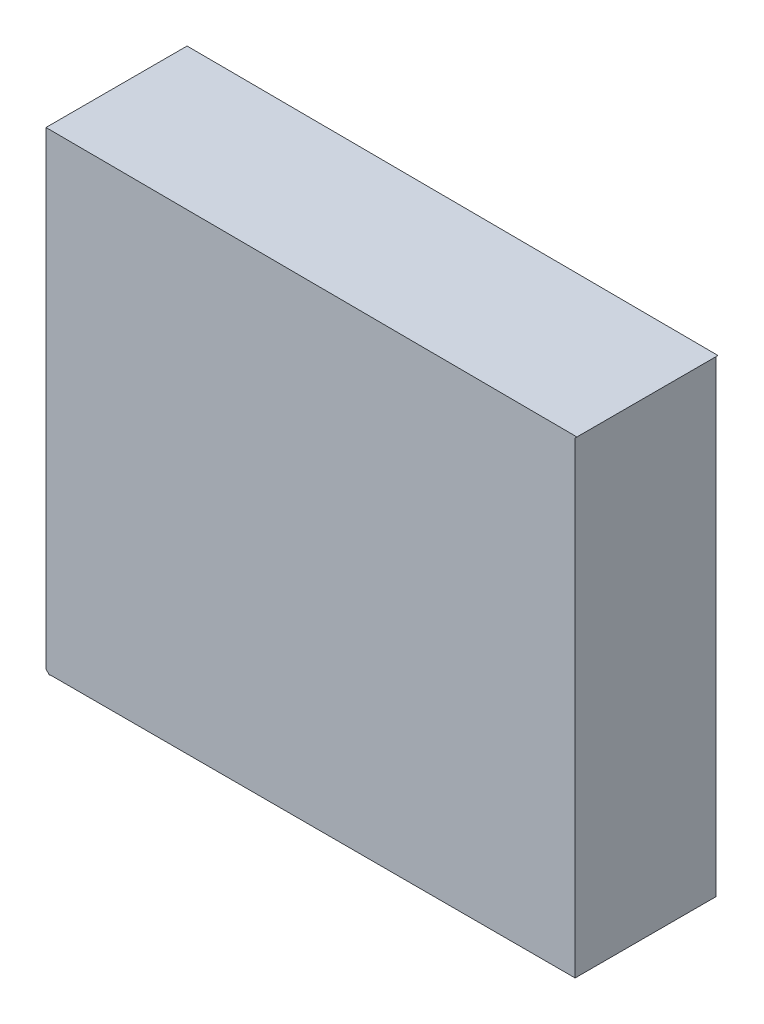
ISO-10303-21;
HEADER;
FILE_DESCRIPTION(('STEP AP214'),'2;1');
FILE_NAME('part.step','',(''),(''),'','','');
FILE_SCHEMA(('AUTOMOTIVE_DESIGN { 1 0 10303 214 1 1 1 1 }'));
ENDSEC;
DATA;
#1=APPLICATION_CONTEXT('core data for automotive mechanical design processes');
#2=APPLICATION_PROTOCOL_DEFINITION('international standard','automotive_design',2000,#1);
#3=PRODUCT_CONTEXT('',#1,'mechanical');
#4=PRODUCT('Part','Part','',(#3));
#5=PRODUCT_RELATED_PRODUCT_CATEGORY('part','',(#4));
#6=PRODUCT_DEFINITION_FORMATION('','',#4);
#7=PRODUCT_DEFINITION_CONTEXT('part definition',#1,'design');
#8=PRODUCT_DEFINITION('design','',#6,#7);
#9=PRODUCT_DEFINITION_SHAPE('','',#8);
#10=(LENGTH_UNIT() NAMED_UNIT(*) SI_UNIT(.MILLI.,.METRE.));
#11=(NAMED_UNIT(*) PLANE_ANGLE_UNIT() SI_UNIT($,.RADIAN.));
#12=(NAMED_UNIT(*) SI_UNIT($,.STERADIAN.) SOLID_ANGLE_UNIT());
#13=UNCERTAINTY_MEASURE_WITH_UNIT(LENGTH_MEASURE(1.E-05),#10,'distance_accuracy_value','');
#14=(GEOMETRIC_REPRESENTATION_CONTEXT(3) GLOBAL_UNCERTAINTY_ASSIGNED_CONTEXT((#13)) GLOBAL_UNIT_ASSIGNED_CONTEXT((#10,
#11,#12)) REPRESENTATION_CONTEXT('',''));
#15=CARTESIAN_POINT('',(0.,0.,0.));
#16=DIRECTION('',(0.,0.,1.));
#17=DIRECTION('',(1.,0.,0.));
#18=AXIS2_PLACEMENT_3D('',#15,#16,#17);
#19=CARTESIAN_POINT('',(3.73759984,3.28800206,0.));
#20=DIRECTION('',(-0.707106781186048,0.707106781187048,0.));
#21=DIRECTION('',(-0.707106781187048,-0.707106781186048,0.));
#22=AXIS2_PLACEMENT_3D('',#19,#20,#21);
#23=PLANE('',#22);
#24=DIRECTION('',(0.,0.,1.));
#25=VECTOR('',#24,1.);
#26=CARTESIAN_POINT('',(3.76299984,3.31340206,0.));
#27=LINE('',#26,#25);
#28=CARTESIAN_POINT('',(3.76299984000001,3.31340205999999,0.));
#29=VERTEX_POINT('',#28);
#30=CARTESIAN_POINT('',(3.76299984000001,3.31340205999999,2.00000108));
#31=VERTEX_POINT('',#30);
#32=EDGE_CURVE('E96',#29,#31,#27,.T.);
#33=ORIENTED_EDGE('',*,*,#32,.T.);
#34=DIRECTION('',(-0.707106781186548,-0.707106781186548,0.));
#35=VECTOR('',#34,1.);
#36=CARTESIAN_POINT('',(3.76299984,3.31340206,2.00000108));
#37=LINE('',#36,#35);
#38=CARTESIAN_POINT('',(3.73759984,3.28800206,2.00000108));
#39=VERTEX_POINT('',#38);
#40=EDGE_CURVE('E85',#31,#39,#37,.T.);
#41=ORIENTED_EDGE('',*,*,#40,.T.);
#42=DIRECTION('',(0.,0.,1.));
#43=VECTOR('',#42,1.);
#44=CARTESIAN_POINT('',(3.73759984,3.28800206,0.));
#45=LINE('',#44,#43);
#46=CARTESIAN_POINT('',(3.73759984,3.28800206,0.));
#47=VERTEX_POINT('',#46);
#48=EDGE_CURVE('E110',#39,#47,#45,.F.);
#49=ORIENTED_EDGE('',*,*,#48,.T.);
#50=DIRECTION('',(-0.707106781187048,-0.707106781186048,0.));
#51=VECTOR('',#50,1.);
#52=CARTESIAN_POINT('',(3.73759984,3.28800206,0.));
#53=LINE('',#52,#51);
#54=EDGE_CURVE('E20',#29,#47,#53,.T.);
#55=ORIENTED_EDGE('',*,*,#54,.F.);
#56=EDGE_LOOP('',(#33,#41,#49,#55));
#57=FACE_BOUND('',#56,.T.);
#58=ADVANCED_FACE('F17',(#57),#23,.F.);
#59=CARTESIAN_POINT('',(-3.71299994,-3.34999838,0.));
#60=DIRECTION('',(-0.707106781186548,0.707106781186548,0.));
#61=DIRECTION('',(-0.707106781186548,-0.707106781186548,0.));
#62=AXIS2_PLACEMENT_3D('',#59,#60,#61);
#63=PLANE('',#62);
#64=DIRECTION('',(0.,0.,1.));
#65=VECTOR('',#64,1.);
#66=CARTESIAN_POINT('',(-3.7043995,-3.34139794,0.));
#67=LINE('',#66,#65);
#68=CARTESIAN_POINT('',(-3.7043995,-3.34139794,0.));
#69=VERTEX_POINT('',#68);
#70=CARTESIAN_POINT('',(-3.7043995,-3.34139794,2.00000108));
#71=VERTEX_POINT('',#70);
#72=EDGE_CURVE('E81',#69,#71,#67,.T.);
#73=ORIENTED_EDGE('',*,*,#72,.T.);
#74=DIRECTION('',(-0.707106781186494,-0.707106781186601,0.));
#75=VECTOR('',#74,1.);
#76=CARTESIAN_POINT('',(-3.7043995,-3.34139794,2.00000108));
#77=LINE('',#76,#75);
#78=CARTESIAN_POINT('',(-3.71299994,-3.34999838,2.00000108));
#79=VERTEX_POINT('',#78);
#80=EDGE_CURVE('E75',#71,#79,#77,.T.);
#81=ORIENTED_EDGE('',*,*,#80,.T.);
#82=DIRECTION('',(0.,0.,1.));
#83=VECTOR('',#82,1.);
#84=CARTESIAN_POINT('',(-3.71299994,-3.34999838,0.));
#85=LINE('',#84,#83);
#86=CARTESIAN_POINT('',(-3.71299994,-3.34999838,0.));
#87=VERTEX_POINT('',#86);
#88=EDGE_CURVE('E79',#79,#87,#85,.F.);
#89=ORIENTED_EDGE('',*,*,#88,.T.);
#90=DIRECTION('',(-0.707106781186548,-0.707106781186548,0.));
#91=VECTOR('',#90,1.);
#92=CARTESIAN_POINT('',(-3.71299994,-3.34999838,0.));
#93=LINE('',#92,#91);
#94=EDGE_CURVE('E70',#69,#87,#93,.T.);
#95=ORIENTED_EDGE('',*,*,#94,.F.);
#96=EDGE_LOOP('',(#73,#81,#89,#95));
#97=FACE_BOUND('',#96,.T.);
#98=ADVANCED_FACE('F77',(#97),#63,.F.);
#99=CARTESIAN_POINT('',(-3.76299984,3.35000092,2.00000108));
#100=DIRECTION('',(0.,0.,-1.));
#101=DIRECTION('',(-1.,0.,0.));
#102=AXIS2_PLACEMENT_3D('',#99,#100,#101);
#103=PLANE('',#102);
#104=DIRECTION('',(-0.707106781186548,0.707106781186548,0.));
#105=VECTOR('',#104,1.);
#106=CARTESIAN_POINT('',(-3.76299984,-3.29999848,2.00000108));
#107=LINE('',#106,#105);
#108=CARTESIAN_POINT('',(-3.76299984,-3.29999848,2.00000108));
#109=VERTEX_POINT('',#108);
#110=EDGE_CURVE('E84',#109,#79,#107,.F.);
#111=ORIENTED_EDGE('',*,*,#110,.T.);
#112=ORIENTED_EDGE('',*,*,#80,.F.);
#113=DIRECTION('',(1.,0.,0.));
#114=VECTOR('',#113,1.);
#115=CARTESIAN_POINT('',(-3.7043995,-3.34139794,2.00000108));
#116=LINE('',#115,#114);
#117=CARTESIAN_POINT('',(3.73759984,-3.34139794,2.00000108));
#118=VERTEX_POINT('',#117);
#119=EDGE_CURVE('E132',#71,#118,#116,.T.);
#120=ORIENTED_EDGE('',*,*,#119,.T.);
#121=DIRECTION('',(0.,1.,0.));
#122=VECTOR('',#121,1.);
#123=CARTESIAN_POINT('',(3.73759984,-3.34139794,2.00000108));
#124=LINE('',#123,#122);
#125=EDGE_CURVE('E115',#118,#39,#124,.T.);
#126=ORIENTED_EDGE('',*,*,#125,.T.);
#127=ORIENTED_EDGE('',*,*,#40,.F.);
#128=DIRECTION('',(0.999988175874613,-0.00486293234209412,0.));
#129=VECTOR('',#128,1.);
#130=CARTESIAN_POINT('',(3.76299984,3.31340206,2.00000108));
#131=LINE('',#130,#129);
#132=CARTESIAN_POINT('',(-3.76299984,3.35000091999999,2.00000108));
#133=VERTEX_POINT('',#132);
#134=EDGE_CURVE('E136',#31,#133,#131,.F.);
#135=ORIENTED_EDGE('',*,*,#134,.T.);
#136=DIRECTION('',(0.,1.,0.));
#137=VECTOR('',#136,1.);
#138=CARTESIAN_POINT('',(-3.76299984,3.35000092,2.00000108));
#139=LINE('',#138,#137);
#140=EDGE_CURVE('E90',#133,#109,#139,.F.);
#141=ORIENTED_EDGE('',*,*,#140,.T.);
#142=EDGE_LOOP('',(#111,#112,#120,#126,#127,#135,#141));
#143=FACE_BOUND('',#142,.T.);
#144=ADVANCED_FACE('F88',(#143),#103,.F.);
#145=CARTESIAN_POINT('',(-3.76299984,-3.29999848,0.));
#146=DIRECTION('',(0.707106781186548,0.707106781186548,0.));
#147=DIRECTION('',(-0.707106781186548,0.707106781186548,0.));
#148=AXIS2_PLACEMENT_3D('',#145,#146,#147);
#149=PLANE('',#148);
#150=ORIENTED_EDGE('',*,*,#88,.F.);
#151=ORIENTED_EDGE('',*,*,#110,.F.);
#152=DIRECTION('',(0.,0.,-1.));
#153=VECTOR('',#152,1.);
#154=CARTESIAN_POINT('',(-3.76299984,-3.29999848,0.));
#155=LINE('',#154,#153);
#156=CARTESIAN_POINT('',(-3.76299984,-3.29999848,0.));
#157=VERTEX_POINT('',#156);
#158=EDGE_CURVE('E123',#109,#157,#155,.T.);
#159=ORIENTED_EDGE('',*,*,#158,.T.);
#160=DIRECTION('',(-0.707106781186548,0.707106781186548,0.));
#161=VECTOR('',#160,1.);
#162=CARTESIAN_POINT('',(-3.76299984,-3.29999848,0.));
#163=LINE('',#162,#161);
#164=EDGE_CURVE('E34',#87,#157,#163,.T.);
#165=ORIENTED_EDGE('',*,*,#164,.F.);
#166=EDGE_LOOP('',(#150,#151,#159,#165));
#167=FACE_BOUND('',#166,.T.);
#168=ADVANCED_FACE('F94',(#167),#149,.F.);
#169=CARTESIAN_POINT('',(3.76299984,3.31340206,0.));
#170=DIRECTION('',(-0.00486293234209412,-0.999988175874613,0.));
#171=DIRECTION('',(0.999988175874613,-0.00486293234209412,0.));
#172=AXIS2_PLACEMENT_3D('',#169,#170,#171);
#173=PLANE('',#172);
#174=DIRECTION('',(0.,0.,-1.));
#175=VECTOR('',#174,1.);
#176=CARTESIAN_POINT('',(-3.76299984,3.35000092,0.));
#177=LINE('',#176,#175);
#178=CARTESIAN_POINT('',(-3.76299984,3.35000091999999,0.));
#179=VERTEX_POINT('',#178);
#180=EDGE_CURVE('E128',#179,#133,#177,.F.);
#181=ORIENTED_EDGE('',*,*,#180,.T.);
#182=ORIENTED_EDGE('',*,*,#134,.F.);
#183=ORIENTED_EDGE('',*,*,#32,.F.);
#184=DIRECTION('',(0.999988175874613,-0.00486293234209785,0.));
#185=VECTOR('',#184,1.);
#186=CARTESIAN_POINT('',(-3.76299984,3.35000092,0.));
#187=LINE('',#186,#185);
#188=EDGE_CURVE('E106',#179,#29,#187,.T.);
#189=ORIENTED_EDGE('',*,*,#188,.F.);
#190=EDGE_LOOP('',(#181,#182,#183,#189));
#191=FACE_BOUND('',#190,.T.);
#192=ADVANCED_FACE('F139',(#191),#173,.F.);
#193=CARTESIAN_POINT('',(3.73759984,-3.34139794,0.));
#194=DIRECTION('',(-1.,0.,0.));
#195=DIRECTION('',(0.,0.,1.));
#196=AXIS2_PLACEMENT_3D('',#193,#194,#195);
#197=PLANE('',#196);
#198=ORIENTED_EDGE('',*,*,#48,.F.);
#199=ORIENTED_EDGE('',*,*,#125,.F.);
#200=DIRECTION('',(0.,0.,1.));
#201=VECTOR('',#200,1.);
#202=CARTESIAN_POINT('',(3.73759984,-3.34139794,0.));
#203=LINE('',#202,#201);
#204=CARTESIAN_POINT('',(3.73759984,-3.34139794,0.));
#205=VERTEX_POINT('',#204);
#206=EDGE_CURVE('E119',#118,#205,#203,.F.);
#207=ORIENTED_EDGE('',*,*,#206,.T.);
#208=DIRECTION('',(0.,1.,0.));
#209=VECTOR('',#208,1.);
#210=CARTESIAN_POINT('',(3.73759984,3.35000092,0.));
#211=LINE('',#210,#209);
#212=EDGE_CURVE('E105',#47,#205,#211,.F.);
#213=ORIENTED_EDGE('',*,*,#212,.F.);
#214=EDGE_LOOP('',(#198,#199,#207,#213));
#215=FACE_BOUND('',#214,.T.);
#216=ADVANCED_FACE('F117',(#215),#197,.F.);
#217=CARTESIAN_POINT('',(-3.7043995,-3.34139794,0.));
#218=DIRECTION('',(0.,1.,0.));
#219=DIRECTION('',(0.,0.,1.));
#220=AXIS2_PLACEMENT_3D('',#217,#218,#219);
#221=PLANE('',#220);
#222=ORIENTED_EDGE('',*,*,#206,.F.);
#223=ORIENTED_EDGE('',*,*,#119,.F.);
#224=ORIENTED_EDGE('',*,*,#72,.F.);
#225=DIRECTION('',(-1.,0.,0.));
#226=VECTOR('',#225,1.);
#227=CARTESIAN_POINT('',(-3.76299984,-3.34139794,0.));
#228=LINE('',#227,#226);
#229=EDGE_CURVE('E26',#205,#69,#228,.T.);
#230=ORIENTED_EDGE('',*,*,#229,.F.);
#231=EDGE_LOOP('',(#222,#223,#224,#230));
#232=FACE_BOUND('',#231,.T.);
#233=ADVANCED_FACE('F145',(#232),#221,.F.);
#234=CARTESIAN_POINT('',(-3.76299984,3.35000092,0.));
#235=DIRECTION('',(1.,0.,0.));
#236=DIRECTION('',(0.,0.,-1.));
#237=AXIS2_PLACEMENT_3D('',#234,#235,#236);
#238=PLANE('',#237);
#239=ORIENTED_EDGE('',*,*,#158,.F.);
#240=ORIENTED_EDGE('',*,*,#140,.F.);
#241=ORIENTED_EDGE('',*,*,#180,.F.);
#242=DIRECTION('',(0.,1.,0.));
#243=VECTOR('',#242,1.);
#244=CARTESIAN_POINT('',(-3.76299984,3.35000092,0.));
#245=LINE('',#244,#243);
#246=EDGE_CURVE('E11',#157,#179,#245,.T.);
#247=ORIENTED_EDGE('',*,*,#246,.F.);
#248=EDGE_LOOP('',(#239,#240,#241,#247));
#249=FACE_BOUND('',#248,.T.);
#250=ADVANCED_FACE('F143',(#249),#238,.F.);
#251=CARTESIAN_POINT('',(-3.76299984,3.35000092,0.));
#252=DIRECTION('',(0.,0.,-1.));
#253=DIRECTION('',(-1.,0.,0.));
#254=AXIS2_PLACEMENT_3D('',#251,#252,#253);
#255=PLANE('',#254);
#256=ORIENTED_EDGE('',*,*,#164,.T.);
#257=ORIENTED_EDGE('',*,*,#246,.T.);
#258=ORIENTED_EDGE('',*,*,#188,.T.);
#259=ORIENTED_EDGE('',*,*,#54,.T.);
#260=ORIENTED_EDGE('',*,*,#212,.T.);
#261=ORIENTED_EDGE('',*,*,#229,.T.);
#262=ORIENTED_EDGE('',*,*,#94,.T.);
#263=EDGE_LOOP('',(#256,#257,#258,#259,#260,#261,#262));
#264=FACE_BOUND('',#263,.T.);
#265=ADVANCED_FACE('F103',(#264),#255,.T.);
#266=CLOSED_SHELL('',(#58,#98,#144,#168,#192,#216,#233,#250,#265));
#267=MANIFOLD_SOLID_BREP('B1',#266);
#268=ADVANCED_BREP_SHAPE_REPRESENTATION('',(#18,#267),#14);
#269=SHAPE_DEFINITION_REPRESENTATION(#9,#268);
ENDSEC;
END-ISO-10303-21;
